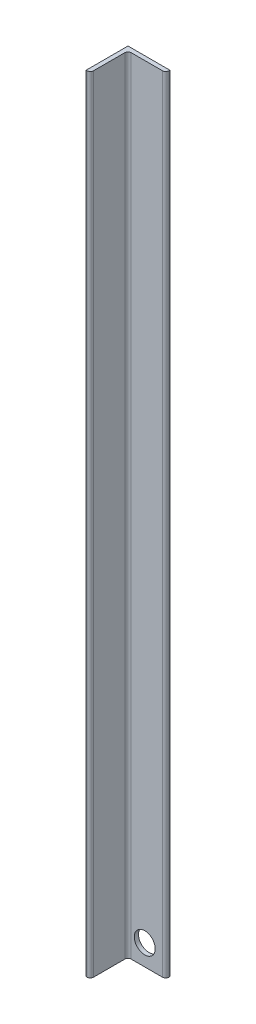
ISO-10303-21;
HEADER;
FILE_DESCRIPTION(('STEP AP214'),'2;1');
FILE_NAME('part.step','',(''),(''),'','','');
FILE_SCHEMA(('AUTOMOTIVE_DESIGN { 1 0 10303 214 1 1 1 1 }'));
ENDSEC;
DATA;
#1=APPLICATION_CONTEXT('core data for automotive mechanical design processes');
#2=APPLICATION_PROTOCOL_DEFINITION('international standard','automotive_design',2000,#1);
#3=PRODUCT_CONTEXT('',#1,'mechanical');
#4=PRODUCT('Part','Part','',(#3));
#5=PRODUCT_RELATED_PRODUCT_CATEGORY('part','',(#4));
#6=PRODUCT_DEFINITION_FORMATION('','',#4);
#7=PRODUCT_DEFINITION_CONTEXT('part definition',#1,'design');
#8=PRODUCT_DEFINITION('design','',#6,#7);
#9=PRODUCT_DEFINITION_SHAPE('','',#8);
#10=(LENGTH_UNIT() NAMED_UNIT(*) SI_UNIT(.MILLI.,.METRE.));
#11=(NAMED_UNIT(*) PLANE_ANGLE_UNIT() SI_UNIT($,.RADIAN.));
#12=(NAMED_UNIT(*) SI_UNIT($,.STERADIAN.) SOLID_ANGLE_UNIT());
#13=UNCERTAINTY_MEASURE_WITH_UNIT(LENGTH_MEASURE(1.E-05),#10,'distance_accuracy_value','');
#14=(GEOMETRIC_REPRESENTATION_CONTEXT(3) GLOBAL_UNCERTAINTY_ASSIGNED_CONTEXT((#13)) GLOBAL_UNIT_ASSIGNED_CONTEXT((#10,
#11,#12)) REPRESENTATION_CONTEXT('',''));
#15=CARTESIAN_POINT('',(0.,0.,0.));
#16=DIRECTION('',(0.,0.,1.));
#17=DIRECTION('',(1.,0.,0.));
#18=AXIS2_PLACEMENT_3D('',#15,#16,#17);
#19=CARTESIAN_POINT('',(-27.499872144956,750.,-28.2131532770166));
#20=DIRECTION('',(-0.999999999999997,0.,0.));
#21=DIRECTION('',(0.,0.,0.999999999999997));
#22=AXIS2_PLACEMENT_3D('',#19,#20,#21);
#23=PLANE('',#22);
#24=DIRECTION('',(0.,0.,-0.999999999999997));
#25=VECTOR('',#24,1.);
#26=CARTESIAN_POINT('',(-27.499872144956,0.,-28.2131532770167));
#27=LINE('',#26,#25);
#28=CARTESIAN_POINT('',(-27.499872144956,0.,-28.2131532770167));
#29=VERTEX_POINT('',#28);
#30=CARTESIAN_POINT('',(-27.499872144956,0.,-29.2131532770166));
#31=VERTEX_POINT('',#30);
#32=EDGE_CURVE('E148',#29,#31,#27,.T.);
#33=ORIENTED_EDGE('',*,*,#32,.T.);
#34=DIRECTION('',(0.,-1.,0.));
#35=VECTOR('',#34,1.);
#36=CARTESIAN_POINT('',(-27.499872144956,750.,-29.2131532770166));
#37=LINE('',#36,#35);
#38=CARTESIAN_POINT('',(-27.499872144956,750.,-29.2131532770166));
#39=VERTEX_POINT('',#38);
#40=EDGE_CURVE('E13',#39,#31,#37,.T.);
#41=ORIENTED_EDGE('',*,*,#40,.F.);
#42=DIRECTION('',(0.,0.,-0.999999999999997));
#43=VECTOR('',#42,1.);
#44=CARTESIAN_POINT('',(-27.499872144956,750.,-28.2131532770166));
#45=LINE('',#44,#43);
#46=CARTESIAN_POINT('',(-27.499872144956,750.,-28.2131532770166));
#47=VERTEX_POINT('',#46);
#48=EDGE_CURVE('E165',#47,#39,#45,.T.);
#49=ORIENTED_EDGE('',*,*,#48,.F.);
#50=DIRECTION('',(0.,-1.,0.));
#51=VECTOR('',#50,1.);
#52=CARTESIAN_POINT('',(-27.499872144956,750.,-28.2131532770166));
#53=LINE('',#52,#51);
#54=EDGE_CURVE('E144',#47,#29,#53,.T.);
#55=ORIENTED_EDGE('',*,*,#54,.T.);
#56=EDGE_LOOP('',(#33,#41,#49,#55));
#57=FACE_BOUND('',#56,.T.);
#58=ADVANCED_FACE('F46',(#57),#23,.F.);
#59=CARTESIAN_POINT('',(-27.499872144956,750.,-29.2131532770166));
#60=DIRECTION('',(0.,0.,0.999999999999997));
#61=DIRECTION('',(0.999999999999997,0.,0.));
#62=AXIS2_PLACEMENT_3D('',#59,#60,#61);
#63=PLANE('',#62);
#64=CARTESIAN_POINT('',(-47.4998721449559,20.,-29.2131532770166));
#65=DIRECTION('',(0.,0.,0.999999999999997));
#66=DIRECTION('',(0.999999999999997,0.,0.));
#67=AXIS2_PLACEMENT_3D('',#64,#65,#66);
#68=CIRCLE('',#67,10.);
#69=CARTESIAN_POINT('',(-37.499872144956,20.,-29.2131532770166));
#70=VERTEX_POINT('',#69);
#71=EDGE_CURVE('E152',#70,#70,#68,.T.);
#72=ORIENTED_EDGE('',*,*,#71,.T.);
#73=EDGE_LOOP('',(#72));
#74=FACE_BOUND('',#73,.T.);
#75=DIRECTION('',(-0.999999999999997,0.,0.));
#76=VECTOR('',#75,1.);
#77=CARTESIAN_POINT('',(-27.499872144956,0.,-29.2131532770166));
#78=LINE('',#77,#76);
#79=CARTESIAN_POINT('',(-67.4998721449556,0.,-29.2131532770166));
#80=VERTEX_POINT('',#79);
#81=EDGE_CURVE('E151',#31,#80,#78,.T.);
#82=ORIENTED_EDGE('',*,*,#81,.T.);
#83=DIRECTION('',(0.,-1.,0.));
#84=VECTOR('',#83,1.);
#85=CARTESIAN_POINT('',(-67.4998721449556,750.,-29.2131532770166));
#86=LINE('',#85,#84);
#87=CARTESIAN_POINT('',(-67.4998721449556,750.,-29.2131532770166));
#88=VERTEX_POINT('',#87);
#89=EDGE_CURVE('E54',#88,#80,#86,.T.);
#90=ORIENTED_EDGE('',*,*,#89,.F.);
#91=DIRECTION('',(-0.999999999999997,0.,0.));
#92=VECTOR('',#91,1.);
#93=CARTESIAN_POINT('',(-27.499872144956,750.,-29.2131532770166));
#94=LINE('',#93,#92);
#95=EDGE_CURVE('E108',#39,#88,#94,.T.);
#96=ORIENTED_EDGE('',*,*,#95,.F.);
#97=ORIENTED_EDGE('',*,*,#40,.T.);
#98=EDGE_LOOP('',(#82,#90,#96,#97));
#99=FACE_BOUND('',#98,.T.);
#100=ADVANCED_FACE('F212',(#74,#99),#63,.F.);
#101=CARTESIAN_POINT('',(-67.4998721449556,750.,-29.2131532770166));
#102=DIRECTION('',(0.999999999999997,0.,0.));
#103=DIRECTION('',(0.,0.,-0.999999999999997));
#104=AXIS2_PLACEMENT_3D('',#101,#102,#103);
#105=PLANE('',#104);
#106=DIRECTION('',(0.,0.,0.999999999999997));
#107=VECTOR('',#106,1.);
#108=CARTESIAN_POINT('',(-67.4998721449556,0.,-29.2131532770166));
#109=LINE('',#108,#107);
#110=CARTESIAN_POINT('',(-67.4998721449556,0.,10.7868467229834));
#111=VERTEX_POINT('',#110);
#112=EDGE_CURVE('E154',#80,#111,#109,.T.);
#113=ORIENTED_EDGE('',*,*,#112,.T.);
#114=DIRECTION('',(0.,-1.,0.));
#115=VECTOR('',#114,1.);
#116=CARTESIAN_POINT('',(-67.4998721449556,750.,10.7868467229834));
#117=LINE('',#116,#115);
#118=CARTESIAN_POINT('',(-67.4998721449556,750.,10.7868467229834));
#119=VERTEX_POINT('',#118);
#120=EDGE_CURVE('E175',#119,#111,#117,.T.);
#121=ORIENTED_EDGE('',*,*,#120,.F.);
#122=DIRECTION('',(0.,0.,0.999999999999997));
#123=VECTOR('',#122,1.);
#124=CARTESIAN_POINT('',(-67.4998721449556,750.,-29.2131532770166));
#125=LINE('',#124,#123);
#126=EDGE_CURVE('E183',#88,#119,#125,.T.);
#127=ORIENTED_EDGE('',*,*,#126,.F.);
#128=ORIENTED_EDGE('',*,*,#89,.T.);
#129=EDGE_LOOP('',(#113,#121,#127,#128));
#130=FACE_BOUND('',#129,.T.);
#131=ADVANCED_FACE('F181',(#130),#105,.F.);
#132=CARTESIAN_POINT('',(-67.4998721449556,750.,10.7868467229834));
#133=DIRECTION('',(0.,0.,-0.999999999999997));
#134=DIRECTION('',(-0.999999999999997,0.,0.));
#135=AXIS2_PLACEMENT_3D('',#132,#133,#134);
#136=PLANE('',#135);
#137=DIRECTION('',(0.999999999999997,0.,0.));
#138=VECTOR('',#137,1.);
#139=CARTESIAN_POINT('',(-67.4998721449556,0.,10.7868467229834));
#140=LINE('',#139,#138);
#141=CARTESIAN_POINT('',(-66.4998721449556,0.,10.7868467229834));
#142=VERTEX_POINT('',#141);
#143=EDGE_CURVE('E156',#111,#142,#140,.T.);
#144=ORIENTED_EDGE('',*,*,#143,.T.);
#145=DIRECTION('',(0.,-1.,0.));
#146=VECTOR('',#145,1.);
#147=CARTESIAN_POINT('',(-66.4998721449556,750.,10.7868467229834));
#148=LINE('',#147,#146);
#149=CARTESIAN_POINT('',(-66.4998721449556,750.,10.7868467229834));
#150=VERTEX_POINT('',#149);
#151=EDGE_CURVE('E172',#150,#142,#148,.T.);
#152=ORIENTED_EDGE('',*,*,#151,.F.);
#153=DIRECTION('',(0.999999999999997,0.,0.));
#154=VECTOR('',#153,1.);
#155=CARTESIAN_POINT('',(-67.4998721449556,750.,10.7868467229834));
#156=LINE('',#155,#154);
#157=EDGE_CURVE('E199',#119,#150,#156,.T.);
#158=ORIENTED_EDGE('',*,*,#157,.F.);
#159=ORIENTED_EDGE('',*,*,#120,.T.);
#160=EDGE_LOOP('',(#144,#152,#158,#159));
#161=FACE_BOUND('',#160,.T.);
#162=ADVANCED_FACE('F192',(#161),#136,.F.);
#163=CARTESIAN_POINT('',(-66.4998721449556,750.,7.78684672298335));
#164=DIRECTION('',(0.,-1.,0.));
#165=DIRECTION('',(0.,0.,-0.999999999999997));
#166=AXIS2_PLACEMENT_3D('',#163,#164,#165);
#167=CYLINDRICAL_SURFACE('',#166,3.);
#168=CARTESIAN_POINT('',(-66.4998721449556,0.,7.78684672298335));
#169=DIRECTION('',(0.,1.,0.));
#170=DIRECTION('',(0.,0.,0.999999999999997));
#171=AXIS2_PLACEMENT_3D('',#168,#169,#170);
#172=CIRCLE('',#171,3.);
#173=CARTESIAN_POINT('',(-63.4998721449556,0.,7.78684672298335));
#174=VERTEX_POINT('',#173);
#175=EDGE_CURVE('E158',#142,#174,#172,.T.);
#176=ORIENTED_EDGE('',*,*,#175,.T.);
#177=DIRECTION('',(0.,-1.,0.));
#178=VECTOR('',#177,1.);
#179=CARTESIAN_POINT('',(-63.4998721449556,750.,7.78684672298335));
#180=LINE('',#179,#178);
#181=CARTESIAN_POINT('',(-63.4998721449556,750.,7.78684672298335));
#182=VERTEX_POINT('',#181);
#183=EDGE_CURVE('E169',#182,#174,#180,.T.);
#184=ORIENTED_EDGE('',*,*,#183,.F.);
#185=CARTESIAN_POINT('',(-66.4998721449556,750.,7.78684672298335));
#186=DIRECTION('',(0.,1.,0.));
#187=DIRECTION('',(0.,0.,0.999999999999997));
#188=AXIS2_PLACEMENT_3D('',#185,#186,#187);
#189=CIRCLE('',#188,3.);
#190=EDGE_CURVE('E198',#150,#182,#189,.T.);
#191=ORIENTED_EDGE('',*,*,#190,.F.);
#192=ORIENTED_EDGE('',*,*,#151,.T.);
#193=EDGE_LOOP('',(#176,#184,#191,#192));
#194=FACE_BOUND('',#193,.T.);
#195=ADVANCED_FACE('F196',(#194),#167,.T.);
#196=CARTESIAN_POINT('',(-63.4998721449556,750.,7.78684672298335));
#197=DIRECTION('',(-0.999999999999997,0.,0.));
#198=DIRECTION('',(0.,0.,0.999999999999997));
#199=AXIS2_PLACEMENT_3D('',#196,#197,#198);
#200=PLANE('',#199);
#201=DIRECTION('',(0.,0.,-0.999999999999997));
#202=VECTOR('',#201,1.);
#203=CARTESIAN_POINT('',(-63.4998721449556,0.,7.78684672298335));
#204=LINE('',#203,#202);
#205=CARTESIAN_POINT('',(-63.4998721449556,0.,-22.2131532770166));
#206=VERTEX_POINT('',#205);
#207=EDGE_CURVE('E160',#174,#206,#204,.T.);
#208=ORIENTED_EDGE('',*,*,#207,.T.);
#209=DIRECTION('',(0.,-1.,0.));
#210=VECTOR('',#209,1.);
#211=CARTESIAN_POINT('',(-63.4998721449556,750.,-22.2131532770166));
#212=LINE('',#211,#210);
#213=CARTESIAN_POINT('',(-63.4998721449556,750.,-22.2131532770166));
#214=VERTEX_POINT('',#213);
#215=EDGE_CURVE('E139',#214,#206,#212,.T.);
#216=ORIENTED_EDGE('',*,*,#215,.F.);
#217=DIRECTION('',(0.,0.,-0.999999999999997));
#218=VECTOR('',#217,1.);
#219=CARTESIAN_POINT('',(-63.4998721449556,750.,7.78684672298335));
#220=LINE('',#219,#218);
#221=EDGE_CURVE('E130',#182,#214,#220,.T.);
#222=ORIENTED_EDGE('',*,*,#221,.F.);
#223=ORIENTED_EDGE('',*,*,#183,.T.);
#224=EDGE_LOOP('',(#208,#216,#222,#223));
#225=FACE_BOUND('',#224,.T.);
#226=ADVANCED_FACE('F228',(#225),#200,.F.);
#227=CARTESIAN_POINT('',(-60.4998721449558,750.,-22.2131532770166));
#228=DIRECTION('',(0.,-1.,0.));
#229=DIRECTION('',(0.,0.,-0.999999999999997));
#230=AXIS2_PLACEMENT_3D('',#227,#228,#229);
#231=CYLINDRICAL_SURFACE('',#230,3.);
#232=CARTESIAN_POINT('',(-60.4998721449558,0.,-22.2131532770167));
#233=DIRECTION('',(0.,-1.,0.));
#234=DIRECTION('',(0.,0.,-0.999999999999997));
#235=AXIS2_PLACEMENT_3D('',#232,#233,#234);
#236=CIRCLE('',#235,3.);
#237=CARTESIAN_POINT('',(-60.4998721449558,0.,-25.2131532770167));
#238=VERTEX_POINT('',#237);
#239=EDGE_CURVE('E138',#206,#238,#236,.T.);
#240=ORIENTED_EDGE('',*,*,#239,.T.);
#241=DIRECTION('',(0.,-1.,0.));
#242=VECTOR('',#241,1.);
#243=CARTESIAN_POINT('',(-60.4998721449558,750.,-25.2131532770166));
#244=LINE('',#243,#242);
#245=CARTESIAN_POINT('',(-60.4998721449558,750.,-25.2131532770166));
#246=VERTEX_POINT('',#245);
#247=EDGE_CURVE('E135',#246,#238,#244,.T.);
#248=ORIENTED_EDGE('',*,*,#247,.F.);
#249=CARTESIAN_POINT('',(-60.4998721449558,750.,-22.2131532770166));
#250=DIRECTION('',(0.,-1.,0.));
#251=DIRECTION('',(0.,0.,-0.999999999999997));
#252=AXIS2_PLACEMENT_3D('',#249,#250,#251);
#253=CIRCLE('',#252,3.);
#254=EDGE_CURVE('E124',#214,#246,#253,.T.);
#255=ORIENTED_EDGE('',*,*,#254,.F.);
#256=ORIENTED_EDGE('',*,*,#215,.T.);
#257=EDGE_LOOP('',(#240,#248,#255,#256));
#258=FACE_BOUND('',#257,.T.);
#259=ADVANCED_FACE('F136',(#258),#231,.F.);
#260=CARTESIAN_POINT('',(-60.4998721449558,750.,-25.2131532770166));
#261=DIRECTION('',(0.,0.,-0.999999999999997));
#262=DIRECTION('',(-0.999999999999997,0.,0.));
#263=AXIS2_PLACEMENT_3D('',#260,#261,#262);
#264=PLANE('',#263);
#265=CARTESIAN_POINT('',(-47.4998721449559,20.,-25.2131532770166));
#266=DIRECTION('',(0.,0.,0.999999999999997));
#267=DIRECTION('',(0.999999999999997,0.,0.));
#268=AXIS2_PLACEMENT_3D('',#265,#266,#267);
#269=CIRCLE('',#268,10.);
#270=CARTESIAN_POINT('',(-37.499872144956,20.,-25.2131532770166));
#271=VERTEX_POINT('',#270);
#272=EDGE_CURVE('E206',#271,#271,#269,.T.);
#273=ORIENTED_EDGE('',*,*,#272,.F.);
#274=EDGE_LOOP('',(#273));
#275=FACE_BOUND('',#274,.T.);
#276=DIRECTION('',(0.999999999999997,0.,0.));
#277=VECTOR('',#276,1.);
#278=CARTESIAN_POINT('',(-60.4998721449558,0.,-25.2131532770166));
#279=LINE('',#278,#277);
#280=CARTESIAN_POINT('',(-30.499872144956,0.,-25.2131532770166));
#281=VERTEX_POINT('',#280);
#282=EDGE_CURVE('E94',#238,#281,#279,.T.);
#283=ORIENTED_EDGE('',*,*,#282,.T.);
#284=DIRECTION('',(0.,-1.,0.));
#285=VECTOR('',#284,1.);
#286=CARTESIAN_POINT('',(-30.499872144956,750.,-25.2131532770166));
#287=LINE('',#286,#285);
#288=CARTESIAN_POINT('',(-30.499872144956,750.,-25.2131532770166));
#289=VERTEX_POINT('',#288);
#290=EDGE_CURVE('E140',#289,#281,#287,.T.);
#291=ORIENTED_EDGE('',*,*,#290,.F.);
#292=DIRECTION('',(0.999999999999997,0.,0.));
#293=VECTOR('',#292,1.);
#294=CARTESIAN_POINT('',(-60.4998721449558,750.,-25.2131532770166));
#295=LINE('',#294,#293);
#296=EDGE_CURVE('E128',#246,#289,#295,.T.);
#297=ORIENTED_EDGE('',*,*,#296,.F.);
#298=ORIENTED_EDGE('',*,*,#247,.T.);
#299=EDGE_LOOP('',(#283,#291,#297,#298));
#300=FACE_BOUND('',#299,.T.);
#301=ADVANCED_FACE('F142',(#275,#300),#264,.F.);
#302=CARTESIAN_POINT('',(-30.499872144956,750.,-28.2131532770166));
#303=DIRECTION('',(0.,-1.,0.));
#304=DIRECTION('',(0.,0.,-0.999999999999997));
#305=AXIS2_PLACEMENT_3D('',#302,#303,#304);
#306=CYLINDRICAL_SURFACE('',#305,3.);
#307=CARTESIAN_POINT('',(-30.499872144956,0.,-28.2131532770166));
#308=DIRECTION('',(0.,1.,0.));
#309=DIRECTION('',(0.,0.,0.999999999999997));
#310=AXIS2_PLACEMENT_3D('',#307,#308,#309);
#311=CIRCLE('',#310,3.);
#312=EDGE_CURVE('E100',#281,#29,#311,.T.);
#313=ORIENTED_EDGE('',*,*,#312,.T.);
#314=ORIENTED_EDGE('',*,*,#54,.F.);
#315=CARTESIAN_POINT('',(-30.499872144956,750.,-28.2131532770166));
#316=DIRECTION('',(0.,1.,0.));
#317=DIRECTION('',(0.,0.,0.999999999999997));
#318=AXIS2_PLACEMENT_3D('',#315,#316,#317);
#319=CIRCLE('',#318,3.);
#320=EDGE_CURVE('E62',#289,#47,#319,.T.);
#321=ORIENTED_EDGE('',*,*,#320,.F.);
#322=ORIENTED_EDGE('',*,*,#290,.T.);
#323=EDGE_LOOP('',(#313,#314,#321,#322));
#324=FACE_BOUND('',#323,.T.);
#325=ADVANCED_FACE('F221',(#324),#306,.T.);
#326=CARTESIAN_POINT('',(-66.4998721449556,750.,7.78684672298335));
#327=DIRECTION('',(0.,1.,0.));
#328=DIRECTION('',(0.,0.,0.999999999999997));
#329=AXIS2_PLACEMENT_3D('',#326,#327,#328);
#330=PLANE('',#329);
#331=ORIENTED_EDGE('',*,*,#48,.T.);
#332=ORIENTED_EDGE('',*,*,#95,.T.);
#333=ORIENTED_EDGE('',*,*,#126,.T.);
#334=ORIENTED_EDGE('',*,*,#157,.T.);
#335=ORIENTED_EDGE('',*,*,#190,.T.);
#336=ORIENTED_EDGE('',*,*,#221,.T.);
#337=ORIENTED_EDGE('',*,*,#254,.T.);
#338=ORIENTED_EDGE('',*,*,#296,.T.);
#339=ORIENTED_EDGE('',*,*,#320,.T.);
#340=EDGE_LOOP('',(#331,#332,#333,#334,#335,#336,#337,#338,#339));
#341=FACE_BOUND('',#340,.T.);
#342=ADVANCED_FACE('F126',(#341),#330,.T.);
#343=CARTESIAN_POINT('',(-66.4998721449556,0.,7.78684672298335));
#344=DIRECTION('',(0.,1.,0.));
#345=DIRECTION('',(0.,0.,0.999999999999997));
#346=AXIS2_PLACEMENT_3D('',#343,#344,#345);
#347=PLANE('',#346);
#348=ORIENTED_EDGE('',*,*,#32,.F.);
#349=ORIENTED_EDGE('',*,*,#312,.F.);
#350=ORIENTED_EDGE('',*,*,#282,.F.);
#351=ORIENTED_EDGE('',*,*,#239,.F.);
#352=ORIENTED_EDGE('',*,*,#207,.F.);
#353=ORIENTED_EDGE('',*,*,#175,.F.);
#354=ORIENTED_EDGE('',*,*,#143,.F.);
#355=ORIENTED_EDGE('',*,*,#112,.F.);
#356=ORIENTED_EDGE('',*,*,#81,.F.);
#357=EDGE_LOOP('',(#348,#349,#350,#351,#352,#353,#354,#355,#356));
#358=FACE_BOUND('',#357,.T.);
#359=ADVANCED_FACE('F187',(#358),#347,.F.);
#360=CARTESIAN_POINT('',(-47.4998721449559,20.,-29.2131532770166));
#361=DIRECTION('',(0.,0.,0.999999999999997));
#362=DIRECTION('',(0.999999999999997,0.,0.));
#363=AXIS2_PLACEMENT_3D('',#360,#361,#362);
#364=CYLINDRICAL_SURFACE('',#363,10.);
#365=CARTESIAN_POINT('',(-37.499872144956,20.,-29.2131532770166));
#366=CARTESIAN_POINT('',(-37.499872144956,20.,-29.17148661035));
#367=CARTESIAN_POINT('',(-37.499872144956,20.,-29.1298199436833));
#368=CARTESIAN_POINT('',(-37.499872144956,20.,-29.04648661035));
#369=CARTESIAN_POINT('',(-37.499872144956,20.,-29.0048199436833));
#370=CARTESIAN_POINT('',(-37.499872144956,20.,-28.92148661035));
#371=CARTESIAN_POINT('',(-37.499872144956,20.,-28.8798199436833));
#372=CARTESIAN_POINT('',(-37.499872144956,20.,-28.79648661035));
#373=CARTESIAN_POINT('',(-37.499872144956,20.,-28.7548199436833));
#374=CARTESIAN_POINT('',(-37.499872144956,20.,-28.67148661035));
#375=CARTESIAN_POINT('',(-37.499872144956,20.,-28.6298199436833));
#376=CARTESIAN_POINT('',(-37.499872144956,20.,-28.54648661035));
#377=CARTESIAN_POINT('',(-37.499872144956,20.,-28.5048199436833));
#378=CARTESIAN_POINT('',(-37.499872144956,20.,-28.42148661035));
#379=CARTESIAN_POINT('',(-37.499872144956,20.,-28.3798199436833));
#380=CARTESIAN_POINT('',(-37.499872144956,20.,-28.29648661035));
#381=CARTESIAN_POINT('',(-37.499872144956,20.,-28.2548199436833));
#382=CARTESIAN_POINT('',(-37.499872144956,20.,-28.17148661035));
#383=CARTESIAN_POINT('',(-37.499872144956,20.,-28.1298199436833));
#384=CARTESIAN_POINT('',(-37.499872144956,20.,-28.04648661035));
#385=CARTESIAN_POINT('',(-37.499872144956,20.,-28.0048199436833));
#386=CARTESIAN_POINT('',(-37.499872144956,20.,-27.92148661035));
#387=CARTESIAN_POINT('',(-37.499872144956,20.,-27.8798199436833));
#388=CARTESIAN_POINT('',(-37.499872144956,20.,-27.79648661035));
#389=CARTESIAN_POINT('',(-37.499872144956,20.,-27.7548199436833));
#390=CARTESIAN_POINT('',(-37.499872144956,20.,-27.67148661035));
#391=CARTESIAN_POINT('',(-37.499872144956,20.,-27.6298199436833));
#392=CARTESIAN_POINT('',(-37.499872144956,20.,-27.54648661035));
#393=CARTESIAN_POINT('',(-37.499872144956,20.,-27.5048199436833));
#394=CARTESIAN_POINT('',(-37.499872144956,20.,-27.42148661035));
#395=CARTESIAN_POINT('',(-37.499872144956,20.,-27.3798199436833));
#396=CARTESIAN_POINT('',(-37.499872144956,20.,-27.29648661035));
#397=CARTESIAN_POINT('',(-37.499872144956,20.,-27.2548199436833));
#398=CARTESIAN_POINT('',(-37.499872144956,20.,-27.17148661035));
#399=CARTESIAN_POINT('',(-37.499872144956,20.,-27.1298199436833));
#400=CARTESIAN_POINT('',(-37.499872144956,20.,-27.04648661035));
#401=CARTESIAN_POINT('',(-37.499872144956,20.,-27.0048199436833));
#402=CARTESIAN_POINT('',(-37.499872144956,20.,-26.92148661035));
#403=CARTESIAN_POINT('',(-37.499872144956,20.,-26.8798199436833));
#404=CARTESIAN_POINT('',(-37.499872144956,20.,-26.79648661035));
#405=CARTESIAN_POINT('',(-37.499872144956,20.,-26.7548199436833));
#406=CARTESIAN_POINT('',(-37.499872144956,20.,-26.67148661035));
#407=CARTESIAN_POINT('',(-37.499872144956,20.,-26.6298199436833));
#408=CARTESIAN_POINT('',(-37.499872144956,20.,-26.54648661035));
#409=CARTESIAN_POINT('',(-37.499872144956,20.,-26.5048199436833));
#410=CARTESIAN_POINT('',(-37.499872144956,20.,-26.42148661035));
#411=CARTESIAN_POINT('',(-37.499872144956,20.,-26.3798199436833));
#412=CARTESIAN_POINT('',(-37.499872144956,20.,-26.29648661035));
#413=CARTESIAN_POINT('',(-37.499872144956,20.,-26.2548199436833));
#414=CARTESIAN_POINT('',(-37.499872144956,20.,-26.17148661035));
#415=CARTESIAN_POINT('',(-37.499872144956,20.,-26.1298199436833));
#416=CARTESIAN_POINT('',(-37.499872144956,20.,-26.04648661035));
#417=CARTESIAN_POINT('',(-37.499872144956,20.,-26.0048199436833));
#418=CARTESIAN_POINT('',(-37.499872144956,20.,-25.92148661035));
#419=CARTESIAN_POINT('',(-37.499872144956,20.,-25.8798199436833));
#420=CARTESIAN_POINT('',(-37.499872144956,20.,-25.79648661035));
#421=CARTESIAN_POINT('',(-37.499872144956,20.,-25.7548199436833));
#422=CARTESIAN_POINT('',(-37.499872144956,20.,-25.67148661035));
#423=CARTESIAN_POINT('',(-37.499872144956,20.,-25.6298199436833));
#424=CARTESIAN_POINT('',(-37.499872144956,20.,-25.54648661035));
#425=CARTESIAN_POINT('',(-37.499872144956,20.,-25.5048199436833));
#426=CARTESIAN_POINT('',(-37.499872144956,20.,-25.42148661035));
#427=CARTESIAN_POINT('',(-37.499872144956,20.,-25.3798199436833));
#428=CARTESIAN_POINT('',(-37.499872144956,20.,-25.29648661035));
#429=CARTESIAN_POINT('',(-37.499872144956,20.,-25.2548199436833));
#430=CARTESIAN_POINT('',(-37.499872144956,20.,-25.2131532770166));
#431=B_SPLINE_CURVE_WITH_KNOTS('',3,(#365,#366,#367,#368,#369,#370,#371,#372,#373,#374,#375,
#376,#377,#378,#379,#380,#381,#382,#383,#384,#385,#386,#387,#388,#389,#390,#391,#392,#393,#394,
#395,#396,#397,#398,#399,#400,#401,#402,#403,#404,#405,#406,#407,#408,#409,#410,#411,#412,#413,
#414,#415,#416,#417,#418,#419,#420,#421,#422,#423,#424,#425,#426,#427,#428,#429,#430),
.UNSPECIFIED.,.F.,.F.,(4,2,2,2,2,2,2,2,2,2,2,2,2,2,2,2,2,2,2,2,2,2,2,2,2,2,2,2,2,2,2,2,4),(0.,
0.125,0.25,0.375,0.5,0.625000000000001,0.750000000000001,0.875000000000001,1.,1.125,1.25,1.375,
1.5,1.625,1.75,1.875,2.,2.125,2.25,2.375,2.5,2.625,2.75,2.875,3.,3.125,3.25,3.375,3.5,3.625,
3.75,3.875,4.),.UNSPECIFIED.);
#432=EDGE_CURVE('BSEAM214',#70,#271,#431,.T.);
#433=ORIENTED_EDGE('',*,*,#71,.F.);
#434=ORIENTED_EDGE('',*,*,#272,.T.);
#435=ORIENTED_EDGE('',*,*,#432,.T.);
#436=ORIENTED_EDGE('',*,*,#432,.F.);
#437=EDGE_LOOP('',(#433,#435,#434,#436));
#438=FACE_BOUND('',#437,.T.);
#439=ADVANCED_FACE('F214',(#438),#364,.F.);
#440=CLOSED_SHELL('',(#58,#100,#131,#162,#195,#226,#259,#301,#325,#342,#359,#439));
#441=MANIFOLD_SOLID_BREP('B2',#440);
#442=ADVANCED_BREP_SHAPE_REPRESENTATION('',(#18,#441),#14);
#443=SHAPE_DEFINITION_REPRESENTATION(#9,#442);
ENDSEC;
END-ISO-10303-21;
